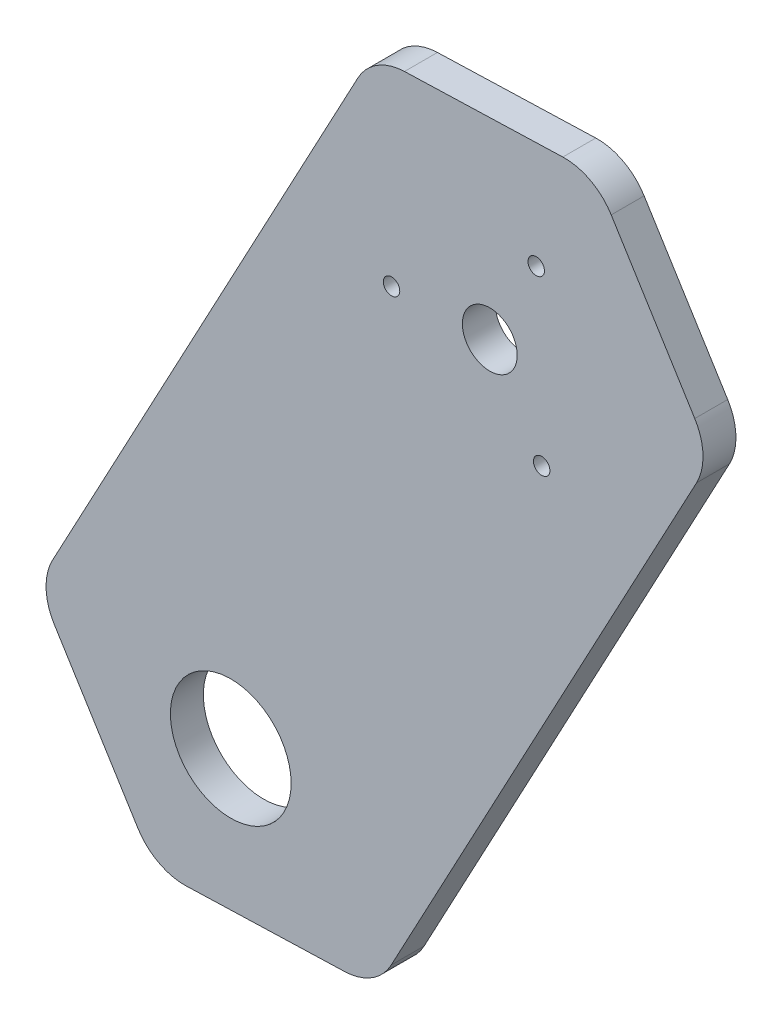
ISO-10303-21;
HEADER;
FILE_DESCRIPTION(('STEP AP214'),'2;1');
FILE_NAME('part.step','',(''),(''),'','','');
FILE_SCHEMA(('AUTOMOTIVE_DESIGN { 1 0 10303 214 1 1 1 1 }'));
ENDSEC;
DATA;
#1=APPLICATION_CONTEXT('core data for automotive mechanical design processes');
#2=APPLICATION_PROTOCOL_DEFINITION('international standard','automotive_design',2000,#1);
#3=PRODUCT_CONTEXT('',#1,'mechanical');
#4=PRODUCT('Part','Part','',(#3));
#5=PRODUCT_RELATED_PRODUCT_CATEGORY('part','',(#4));
#6=PRODUCT_DEFINITION_FORMATION('','',#4);
#7=PRODUCT_DEFINITION_CONTEXT('part definition',#1,'design');
#8=PRODUCT_DEFINITION('design','',#6,#7);
#9=PRODUCT_DEFINITION_SHAPE('','',#8);
#10=(LENGTH_UNIT() NAMED_UNIT(*) SI_UNIT(.MILLI.,.METRE.));
#11=(NAMED_UNIT(*) PLANE_ANGLE_UNIT() SI_UNIT($,.RADIAN.));
#12=(NAMED_UNIT(*) SI_UNIT($,.STERADIAN.) SOLID_ANGLE_UNIT());
#13=UNCERTAINTY_MEASURE_WITH_UNIT(LENGTH_MEASURE(1.E-05),#10,'distance_accuracy_value','');
#14=(GEOMETRIC_REPRESENTATION_CONTEXT(3) GLOBAL_UNCERTAINTY_ASSIGNED_CONTEXT((#13)) GLOBAL_UNIT_ASSIGNED_CONTEXT((#10,
#11,#12)) REPRESENTATION_CONTEXT('',''));
#15=CARTESIAN_POINT('',(0.,0.,0.));
#16=DIRECTION('',(0.,0.,1.));
#17=DIRECTION('',(1.,0.,0.));
#18=AXIS2_PLACEMENT_3D('',#15,#16,#17);
#19=CARTESIAN_POINT('',(33.0816922006675,382.696308573384,6.));
#20=DIRECTION('',(0.,0.,1.));
#21=DIRECTION('',(1.,0.,0.));
#22=AXIS2_PLACEMENT_3D('',#19,#20,#21);
#23=PLANE('',#22);
#24=CARTESIAN_POINT('',(30.4001110546229,357.59764771991,6.));
#25=DIRECTION('',(0.,0.,1.));
#26=DIRECTION('',(1.,0.,0.));
#27=AXIS2_PLACEMENT_3D('',#24,#25,#26);
#28=CIRCLE('',#27,1.50000000000101);
#29=CARTESIAN_POINT('',(31.9001110546239,357.59764771991,6.));
#30=VERTEX_POINT('',#29);
#31=EDGE_CURVE('E302',#30,#30,#28,.T.);
#32=ORIENTED_EDGE('',*,*,#31,.F.);
#33=EDGE_LOOP('',(#32));
#34=FACE_BOUND('',#33,.T.);
#35=CARTESIAN_POINT('',(57.7585097588959,342.948926532445,6.));
#36=DIRECTION('',(0.,0.,1.));
#37=DIRECTION('',(1.,0.,0.));
#38=AXIS2_PLACEMENT_3D('',#35,#36,#37);
#39=CIRCLE('',#38,1.50000000000001);
#40=CARTESIAN_POINT('',(59.2585097588959,342.948926532445,6.));
#41=VERTEX_POINT('',#40);
#42=EDGE_CURVE('E314',#41,#41,#39,.T.);
#43=ORIENTED_EDGE('',*,*,#42,.F.);
#44=EDGE_LOOP('',(#43));
#45=FACE_BOUND('',#44,.T.);
#46=CARTESIAN_POINT('',(33.0816922006675,382.696308573384,6.));
#47=DIRECTION('',(0.,0.,1.));
#48=DIRECTION('',(1.,0.,0.));
#49=AXIS2_PLACEMENT_3D('',#46,#47,#48);
#50=CIRCLE('',#49,10.0000000000104);
#51=CARTESIAN_POINT('',(32.7617023836289,392.691187588019,6.));
#52=VERTEX_POINT('',#51);
#53=CARTESIAN_POINT('',(24.2658781577215,387.416628770193,6.));
#54=VERTEX_POINT('',#53);
#55=EDGE_CURVE('E184',#52,#54,#50,.T.);
#56=ORIENTED_EDGE('',*,*,#55,.T.);
#57=DIRECTION('',(-0.472032019680439,-0.881581404293674,0.));
#58=VECTOR('',#57,1.);
#59=CARTESIAN_POINT('',(-31.3713622752696,283.506820733978,6.));
#60=LINE('',#59,#58);
#61=CARTESIAN_POINT('',(-31.3713622752696,283.506820733978,6.));
#62=VERTEX_POINT('',#61);
#63=EDGE_CURVE('E112',#54,#62,#60,.T.);
#64=ORIENTED_EDGE('',*,*,#63,.T.);
#65=CARTESIAN_POINT('',(-22.5555482323431,278.786500537179,6.));
#66=DIRECTION('',(0.,0.,1.));
#67=DIRECTION('',(1.,0.,0.));
#68=AXIS2_PLACEMENT_3D('',#65,#66,#67);
#69=CIRCLE('',#68,9.99999999998837);
#70=CARTESIAN_POINT('',(-31.0513724582303,273.511941719364,6.));
#71=VERTEX_POINT('',#70);
#72=EDGE_CURVE('E211',#62,#71,#69,.T.);
#73=ORIENTED_EDGE('',*,*,#72,.T.);
#74=DIRECTION('',(0.527455881781989,-0.849582422589818,0.));
#75=VECTOR('',#74,1.);
#76=CARTESIAN_POINT('',(-15.8250326916056,248.986609700313,6.));
#77=LINE('',#76,#75);
#78=CARTESIAN_POINT('',(-15.8250326916056,248.986609700313,6.));
#79=VERTEX_POINT('',#78);
#80=EDGE_CURVE('E230',#71,#79,#77,.T.);
#81=ORIENTED_EDGE('',*,*,#80,.T.);
#82=CARTESIAN_POINT('',(-7.32920846570756,254.261168518133,6.));
#83=DIRECTION('',(0.,0.,1.));
#84=DIRECTION('',(1.,0.,0.));
#85=AXIS2_PLACEMENT_3D('',#82,#83,#84);
#86=CIRCLE('',#85,9.99999999999989);
#87=CARTESIAN_POINT('',(-7.00921864866926,244.266289503508,6.));
#88=VERTEX_POINT('',#87);
#89=EDGE_CURVE('E227',#79,#88,#86,.T.);
#90=ORIENTED_EDGE('',*,*,#89,.T.);
#91=DIRECTION('',(0.999487901462503,0.0319989817038313,0.));
#92=VECTOR('',#91,1.);
#93=CARTESIAN_POINT('',(21.8435117993893,245.190020538533,6.));
#94=LINE('',#93,#92);
#95=CARTESIAN_POINT('',(21.8435117993893,245.190020538533,6.));
#96=VERTEX_POINT('',#95);
#97=EDGE_CURVE('E229',#88,#96,#94,.T.);
#98=ORIENTED_EDGE('',*,*,#97,.T.);
#99=CARTESIAN_POINT('',(21.5235219823509,255.184899553158,6.));
#100=DIRECTION('',(0.,0.,1.));
#101=DIRECTION('',(1.,0.,0.));
#102=AXIS2_PLACEMENT_3D('',#99,#100,#101);
#103=CIRCLE('',#102,9.99999999999985);
#104=CARTESIAN_POINT('',(30.3393360252871,250.464579356352,6.));
#105=VERTEX_POINT('',#104);
#106=EDGE_CURVE('E232',#96,#105,#103,.T.);
#107=ORIENTED_EDGE('',*,*,#106,.T.);
#108=DIRECTION('',(0.472032019680519,0.881581404293631,0.));
#109=VECTOR('',#108,1.);
#110=CARTESIAN_POINT('',(85.9765764582877,354.374387392562,6.));
#111=LINE('',#110,#109);
#112=CARTESIAN_POINT('',(85.9765764582877,354.374387392562,6.));
#113=VERTEX_POINT('',#112);
#114=EDGE_CURVE('E238',#105,#113,#111,.T.);
#115=ORIENTED_EDGE('',*,*,#114,.T.);
#116=CARTESIAN_POINT('',(77.1607624153515,359.094707589367,6.));
#117=DIRECTION('',(0.,0.,1.));
#118=DIRECTION('',(1.,0.,0.));
#119=AXIS2_PLACEMENT_3D('',#116,#117,#118);
#120=CIRCLE('',#119,9.99999999999986);
#121=CARTESIAN_POINT('',(85.6565866412496,364.369266407187,6.));
#122=VERTEX_POINT('',#121);
#123=EDGE_CURVE('E143',#113,#122,#120,.T.);
#124=ORIENTED_EDGE('',*,*,#123,.T.);
#125=DIRECTION('',(-0.527455881781988,0.849582422589819,0.));
#126=VECTOR('',#125,1.);
#127=CARTESIAN_POINT('',(70.4302468746245,388.894598426239,6.));
#128=LINE('',#127,#126);
#129=CARTESIAN_POINT('',(70.4302468746245,388.894598426239,6.));
#130=VERTEX_POINT('',#129);
#131=EDGE_CURVE('E137',#122,#130,#128,.T.);
#132=ORIENTED_EDGE('',*,*,#131,.T.);
#133=CARTESIAN_POINT('',(61.9344226487265,383.620039608419,6.));
#134=DIRECTION('',(0.,0.,1.));
#135=DIRECTION('',(1.,0.,0.));
#136=AXIS2_PLACEMENT_3D('',#133,#134,#135);
#137=CIRCLE('',#136,9.99999999999985);
#138=CARTESIAN_POINT('',(61.6144328316882,393.614918623044,6.));
#139=VERTEX_POINT('',#138);
#140=EDGE_CURVE('E141',#130,#139,#137,.T.);
#141=ORIENTED_EDGE('',*,*,#140,.T.);
#142=DIRECTION('',(-0.999487901462503,-0.0319989817038246,0.));
#143=VECTOR('',#142,1.);
#144=CARTESIAN_POINT('',(32.7617023836289,392.691187588019,6.));
#145=LINE('',#144,#143);
#146=EDGE_CURVE('E57',#139,#52,#145,.T.);
#147=ORIENTED_EDGE('',*,*,#146,.T.);
#148=EDGE_LOOP('',(#56,#64,#73,#81,#90,#98,#107,#115,#124,#132,#141,#147));
#149=FACE_BOUND('',#148,.T.);
#150=CARTESIAN_POINT('',(1.10482999928468,270.012836124959,6.));
#151=DIRECTION('',(0.,0.,1.));
#152=DIRECTION('',(1.,0.,0.));
#153=AXIS2_PLACEMENT_3D('',#150,#151,#152);
#154=CIRCLE('',#153,10.9999999999999);
#155=CARTESIAN_POINT('',(12.1048299992846,270.012836124959,6.));
#156=VERTEX_POINT('',#155);
#157=EDGE_CURVE('E165',#156,#156,#154,.T.);
#158=ORIENTED_EDGE('',*,*,#157,.F.);
#159=EDGE_LOOP('',(#158));
#160=FACE_BOUND('',#159,.T.);
#161=CARTESIAN_POINT('',(56.7654750880588,373.966355410941,6.));
#162=DIRECTION('',(0.,0.,1.));
#163=DIRECTION('',(1.,0.,0.));
#164=AXIS2_PLACEMENT_3D('',#161,#162,#163);
#165=CIRCLE('',#164,1.5);
#166=CARTESIAN_POINT('',(58.2654750880588,373.966355410941,6.));
#167=VERTEX_POINT('',#166);
#168=EDGE_CURVE('E308',#167,#167,#165,.T.);
#169=ORIENTED_EDGE('',*,*,#168,.F.);
#170=EDGE_LOOP('',(#169));
#171=FACE_BOUND('',#170,.T.);
#172=CARTESIAN_POINT('',(48.3080319671885,358.170976554401,6.));
#173=DIRECTION('',(0.,0.,1.));
#174=DIRECTION('',(1.,0.,0.));
#175=AXIS2_PLACEMENT_3D('',#172,#173,#174);
#176=CIRCLE('',#175,4.99999999999982);
#177=CARTESIAN_POINT('',(53.3080319671883,358.170976554401,6.));
#178=VERTEX_POINT('',#177);
#179=EDGE_CURVE('E293',#178,#178,#176,.T.);
#180=ORIENTED_EDGE('',*,*,#179,.F.);
#181=EDGE_LOOP('',(#180));
#182=FACE_BOUND('',#181,.T.);
#183=ADVANCED_FACE('F40',(#34,#45,#149,#160,#171,#182),#23,.T.);
#184=CARTESIAN_POINT('',(33.0816922006675,382.696308573384,0.));
#185=DIRECTION('',(0.,0.,1.));
#186=DIRECTION('',(1.,0.,0.));
#187=AXIS2_PLACEMENT_3D('',#184,#185,#186);
#188=PLANE('',#187);
#189=CARTESIAN_POINT('',(33.0816922006675,382.696308573384,0.));
#190=DIRECTION('',(0.,0.,1.));
#191=DIRECTION('',(1.,0.,0.));
#192=AXIS2_PLACEMENT_3D('',#189,#190,#191);
#193=CIRCLE('',#192,10.0000000000104);
#194=CARTESIAN_POINT('',(32.7617023836289,392.691187588019,0.));
#195=VERTEX_POINT('',#194);
#196=CARTESIAN_POINT('',(24.2658781577215,387.416628770193,0.));
#197=VERTEX_POINT('',#196);
#198=EDGE_CURVE('E161',#195,#197,#193,.T.);
#199=ORIENTED_EDGE('',*,*,#198,.F.);
#200=DIRECTION('',(-0.999487901462503,-0.0319989817038246,0.));
#201=VECTOR('',#200,1.);
#202=CARTESIAN_POINT('',(32.7617023836289,392.691187588019,0.));
#203=LINE('',#202,#201);
#204=CARTESIAN_POINT('',(61.6144328316882,393.614918623044,0.));
#205=VERTEX_POINT('',#204);
#206=EDGE_CURVE('E104',#205,#195,#203,.T.);
#207=ORIENTED_EDGE('',*,*,#206,.F.);
#208=CARTESIAN_POINT('',(61.9344226487265,383.620039608419,0.));
#209=DIRECTION('',(0.,0.,1.));
#210=DIRECTION('',(1.,0.,0.));
#211=AXIS2_PLACEMENT_3D('',#208,#209,#210);
#212=CIRCLE('',#211,9.99999999999985);
#213=CARTESIAN_POINT('',(70.4302468746245,388.894598426239,0.));
#214=VERTEX_POINT('',#213);
#215=EDGE_CURVE('E98',#214,#205,#212,.T.);
#216=ORIENTED_EDGE('',*,*,#215,.F.);
#217=DIRECTION('',(-0.527455881781988,0.849582422589819,0.));
#218=VECTOR('',#217,1.);
#219=CARTESIAN_POINT('',(70.4302468746245,388.894598426239,0.));
#220=LINE('',#219,#218);
#221=CARTESIAN_POINT('',(85.6565866412496,364.369266407187,0.));
#222=VERTEX_POINT('',#221);
#223=EDGE_CURVE('E151',#222,#214,#220,.T.);
#224=ORIENTED_EDGE('',*,*,#223,.F.);
#225=CARTESIAN_POINT('',(77.1607624153515,359.094707589367,0.));
#226=DIRECTION('',(0.,0.,1.));
#227=DIRECTION('',(1.,0.,0.));
#228=AXIS2_PLACEMENT_3D('',#225,#226,#227);
#229=CIRCLE('',#228,9.99999999999986);
#230=CARTESIAN_POINT('',(85.9765764582877,354.374387392562,0.));
#231=VERTEX_POINT('',#230);
#232=EDGE_CURVE('E179',#231,#222,#229,.T.);
#233=ORIENTED_EDGE('',*,*,#232,.F.);
#234=DIRECTION('',(0.472032019680519,0.881581404293631,0.));
#235=VECTOR('',#234,1.);
#236=CARTESIAN_POINT('',(85.9765764582877,354.374387392562,0.));
#237=LINE('',#236,#235);
#238=CARTESIAN_POINT('',(30.3393360252871,250.464579356352,0.));
#239=VERTEX_POINT('',#238);
#240=EDGE_CURVE('E177',#239,#231,#237,.T.);
#241=ORIENTED_EDGE('',*,*,#240,.F.);
#242=CARTESIAN_POINT('',(21.5235219823509,255.184899553158,0.));
#243=DIRECTION('',(0.,0.,1.));
#244=DIRECTION('',(1.,0.,0.));
#245=AXIS2_PLACEMENT_3D('',#242,#243,#244);
#246=CIRCLE('',#245,9.99999999999985);
#247=CARTESIAN_POINT('',(21.8435117993893,245.190020538533,0.));
#248=VERTEX_POINT('',#247);
#249=EDGE_CURVE('E175',#248,#239,#246,.T.);
#250=ORIENTED_EDGE('',*,*,#249,.F.);
#251=DIRECTION('',(0.999487901462503,0.0319989817038313,0.));
#252=VECTOR('',#251,1.);
#253=CARTESIAN_POINT('',(21.8435117993893,245.190020538533,0.));
#254=LINE('',#253,#252);
#255=CARTESIAN_POINT('',(-7.00921864866926,244.266289503508,0.));
#256=VERTEX_POINT('',#255);
#257=EDGE_CURVE('E173',#256,#248,#254,.T.);
#258=ORIENTED_EDGE('',*,*,#257,.F.);
#259=CARTESIAN_POINT('',(-7.32920846570756,254.261168518133,0.));
#260=DIRECTION('',(0.,0.,1.));
#261=DIRECTION('',(1.,0.,0.));
#262=AXIS2_PLACEMENT_3D('',#259,#260,#261);
#263=CIRCLE('',#262,9.99999999999989);
#264=CARTESIAN_POINT('',(-15.8250326916056,248.986609700313,0.));
#265=VERTEX_POINT('',#264);
#266=EDGE_CURVE('E171',#265,#256,#263,.T.);
#267=ORIENTED_EDGE('',*,*,#266,.F.);
#268=DIRECTION('',(0.527455881781989,-0.849582422589818,0.));
#269=VECTOR('',#268,1.);
#270=CARTESIAN_POINT('',(-15.8250326916056,248.986609700313,0.));
#271=LINE('',#270,#269);
#272=CARTESIAN_POINT('',(-31.0513724582303,273.511941719364,0.));
#273=VERTEX_POINT('',#272);
#274=EDGE_CURVE('E169',#273,#265,#271,.T.);
#275=ORIENTED_EDGE('',*,*,#274,.F.);
#276=CARTESIAN_POINT('',(-22.5555482323431,278.786500537179,0.));
#277=DIRECTION('',(0.,0.,1.));
#278=DIRECTION('',(1.,0.,0.));
#279=AXIS2_PLACEMENT_3D('',#276,#277,#278);
#280=CIRCLE('',#279,9.99999999998837);
#281=CARTESIAN_POINT('',(-31.3713622752696,283.506820733978,0.));
#282=VERTEX_POINT('',#281);
#283=EDGE_CURVE('E167',#282,#273,#280,.T.);
#284=ORIENTED_EDGE('',*,*,#283,.F.);
#285=DIRECTION('',(-0.472032019680439,-0.881581404293674,0.));
#286=VECTOR('',#285,1.);
#287=CARTESIAN_POINT('',(-31.3713622752696,283.506820733978,0.));
#288=LINE('',#287,#286);
#289=EDGE_CURVE('E164',#197,#282,#288,.T.);
#290=ORIENTED_EDGE('',*,*,#289,.F.);
#291=EDGE_LOOP('',(#199,#207,#216,#224,#233,#241,#250,#258,#267,#275,#284,#290));
#292=FACE_BOUND('',#291,.T.);
#293=CARTESIAN_POINT('',(1.10482999928468,270.012836124959,0.));
#294=DIRECTION('',(0.,0.,1.));
#295=DIRECTION('',(1.,0.,0.));
#296=AXIS2_PLACEMENT_3D('',#293,#294,#295);
#297=CIRCLE('',#296,10.9999999999999);
#298=CARTESIAN_POINT('',(12.1048299992846,270.012836124959,0.));
#299=VERTEX_POINT('',#298);
#300=EDGE_CURVE('E317',#299,#299,#297,.T.);
#301=ORIENTED_EDGE('',*,*,#300,.T.);
#302=EDGE_LOOP('',(#301));
#303=FACE_BOUND('',#302,.T.);
#304=CARTESIAN_POINT('',(57.7585097588959,342.948926532445,0.));
#305=DIRECTION('',(0.,0.,1.));
#306=DIRECTION('',(1.,0.,0.));
#307=AXIS2_PLACEMENT_3D('',#304,#305,#306);
#308=CIRCLE('',#307,1.50000000000001);
#309=CARTESIAN_POINT('',(59.2585097588959,342.948926532445,0.));
#310=VERTEX_POINT('',#309);
#311=EDGE_CURVE('E311',#310,#310,#308,.T.);
#312=ORIENTED_EDGE('',*,*,#311,.T.);
#313=EDGE_LOOP('',(#312));
#314=FACE_BOUND('',#313,.T.);
#315=CARTESIAN_POINT('',(56.7654750880588,373.966355410941,0.));
#316=DIRECTION('',(0.,0.,1.));
#317=DIRECTION('',(1.,0.,0.));
#318=AXIS2_PLACEMENT_3D('',#315,#316,#317);
#319=CIRCLE('',#318,1.5);
#320=CARTESIAN_POINT('',(58.2654750880588,373.966355410941,0.));
#321=VERTEX_POINT('',#320);
#322=EDGE_CURVE('E305',#321,#321,#319,.T.);
#323=ORIENTED_EDGE('',*,*,#322,.T.);
#324=EDGE_LOOP('',(#323));
#325=FACE_BOUND('',#324,.T.);
#326=CARTESIAN_POINT('',(30.4001110546229,357.59764771991,0.));
#327=DIRECTION('',(0.,0.,1.));
#328=DIRECTION('',(1.,0.,0.));
#329=AXIS2_PLACEMENT_3D('',#326,#327,#328);
#330=CIRCLE('',#329,1.50000000000101);
#331=CARTESIAN_POINT('',(31.9001110546239,357.59764771991,0.));
#332=VERTEX_POINT('',#331);
#333=EDGE_CURVE('E299',#332,#332,#330,.T.);
#334=ORIENTED_EDGE('',*,*,#333,.T.);
#335=EDGE_LOOP('',(#334));
#336=FACE_BOUND('',#335,.T.);
#337=CARTESIAN_POINT('',(48.3080319671885,358.170976554401,0.));
#338=DIRECTION('',(0.,0.,1.));
#339=DIRECTION('',(1.,0.,0.));
#340=AXIS2_PLACEMENT_3D('',#337,#338,#339);
#341=CIRCLE('',#340,4.99999999999982);
#342=CARTESIAN_POINT('',(53.3080319671883,358.170976554401,0.));
#343=VERTEX_POINT('',#342);
#344=EDGE_CURVE('E296',#343,#343,#341,.T.);
#345=ORIENTED_EDGE('',*,*,#344,.T.);
#346=EDGE_LOOP('',(#345));
#347=FACE_BOUND('',#346,.T.);
#348=ADVANCED_FACE('F215',(#292,#303,#314,#325,#336,#347),#188,.F.);
#349=CARTESIAN_POINT('',(33.0816922006675,382.696308573384,6.));
#350=DIRECTION('',(0.,0.,-1.));
#351=DIRECTION('',(-1.,0.,0.));
#352=AXIS2_PLACEMENT_3D('',#349,#350,#351);
#353=CYLINDRICAL_SURFACE('',#352,10.0000000000104);
#354=ORIENTED_EDGE('',*,*,#198,.T.);
#355=DIRECTION('',(0.,0.,-1.));
#356=VECTOR('',#355,1.);
#357=CARTESIAN_POINT('',(24.2658781577215,387.416628770193,6.));
#358=LINE('',#357,#356);
#359=EDGE_CURVE('E11',#54,#197,#358,.T.);
#360=ORIENTED_EDGE('',*,*,#359,.F.);
#361=ORIENTED_EDGE('',*,*,#55,.F.);
#362=DIRECTION('',(0.,0.,-1.));
#363=VECTOR('',#362,1.);
#364=CARTESIAN_POINT('',(32.7617023836289,392.691187588019,6.));
#365=LINE('',#364,#363);
#366=EDGE_CURVE('E157',#52,#195,#365,.T.);
#367=ORIENTED_EDGE('',*,*,#366,.T.);
#368=EDGE_LOOP('',(#354,#360,#361,#367));
#369=FACE_BOUND('',#368,.T.);
#370=ADVANCED_FACE('F42',(#369),#353,.T.);
#371=CARTESIAN_POINT('',(-31.3713622752696,283.506820733978,6.));
#372=DIRECTION('',(0.881581404293674,-0.472032019680439,0.));
#373=DIRECTION('',(0.472032019680439,0.881581404293674,0.));
#374=AXIS2_PLACEMENT_3D('',#371,#372,#373);
#375=PLANE('',#374);
#376=ORIENTED_EDGE('',*,*,#289,.T.);
#377=DIRECTION('',(0.,0.,-1.));
#378=VECTOR('',#377,1.);
#379=CARTESIAN_POINT('',(-31.3713622752696,283.506820733978,6.));
#380=LINE('',#379,#378);
#381=EDGE_CURVE('E49',#62,#282,#380,.T.);
#382=ORIENTED_EDGE('',*,*,#381,.F.);
#383=ORIENTED_EDGE('',*,*,#63,.F.);
#384=ORIENTED_EDGE('',*,*,#359,.T.);
#385=EDGE_LOOP('',(#376,#382,#383,#384));
#386=FACE_BOUND('',#385,.T.);
#387=ADVANCED_FACE('F446',(#386),#375,.F.);
#388=CARTESIAN_POINT('',(-22.5555482323431,278.786500537179,6.));
#389=DIRECTION('',(0.,0.,-1.));
#390=DIRECTION('',(-1.,0.,0.));
#391=AXIS2_PLACEMENT_3D('',#388,#389,#390);
#392=CYLINDRICAL_SURFACE('',#391,9.99999999998837);
#393=ORIENTED_EDGE('',*,*,#283,.T.);
#394=DIRECTION('',(0.,0.,-1.));
#395=VECTOR('',#394,1.);
#396=CARTESIAN_POINT('',(-31.0513724582303,273.511941719364,6.));
#397=LINE('',#396,#395);
#398=EDGE_CURVE('E203',#71,#273,#397,.T.);
#399=ORIENTED_EDGE('',*,*,#398,.F.);
#400=ORIENTED_EDGE('',*,*,#72,.F.);
#401=ORIENTED_EDGE('',*,*,#381,.T.);
#402=EDGE_LOOP('',(#393,#399,#400,#401));
#403=FACE_BOUND('',#402,.T.);
#404=ADVANCED_FACE('F209',(#403),#392,.T.);
#405=CARTESIAN_POINT('',(-15.8250326916056,248.986609700313,6.));
#406=DIRECTION('',(0.849582422589818,0.527455881781989,0.));
#407=DIRECTION('',(-0.527455881781989,0.849582422589818,0.));
#408=AXIS2_PLACEMENT_3D('',#405,#406,#407);
#409=PLANE('',#408);
#410=ORIENTED_EDGE('',*,*,#274,.T.);
#411=DIRECTION('',(0.,0.,-1.));
#412=VECTOR('',#411,1.);
#413=CARTESIAN_POINT('',(-15.8250326916056,248.986609700313,6.));
#414=LINE('',#413,#412);
#415=EDGE_CURVE('E200',#79,#265,#414,.T.);
#416=ORIENTED_EDGE('',*,*,#415,.F.);
#417=ORIENTED_EDGE('',*,*,#80,.F.);
#418=ORIENTED_EDGE('',*,*,#398,.T.);
#419=EDGE_LOOP('',(#410,#416,#417,#418));
#420=FACE_BOUND('',#419,.T.);
#421=ADVANCED_FACE('F221',(#420),#409,.F.);
#422=CARTESIAN_POINT('',(-7.32920846570756,254.261168518133,6.));
#423=DIRECTION('',(0.,0.,-1.));
#424=DIRECTION('',(-1.,0.,0.));
#425=AXIS2_PLACEMENT_3D('',#422,#423,#424);
#426=CYLINDRICAL_SURFACE('',#425,9.99999999999989);
#427=ORIENTED_EDGE('',*,*,#266,.T.);
#428=DIRECTION('',(0.,0.,-1.));
#429=VECTOR('',#428,1.);
#430=CARTESIAN_POINT('',(-7.00921864866926,244.266289503508,6.));
#431=LINE('',#430,#429);
#432=EDGE_CURVE('E197',#88,#256,#431,.T.);
#433=ORIENTED_EDGE('',*,*,#432,.F.);
#434=ORIENTED_EDGE('',*,*,#89,.F.);
#435=ORIENTED_EDGE('',*,*,#415,.T.);
#436=EDGE_LOOP('',(#427,#433,#434,#435));
#437=FACE_BOUND('',#436,.T.);
#438=ADVANCED_FACE('F225',(#437),#426,.T.);
#439=CARTESIAN_POINT('',(21.8435117993893,245.190020538533,6.));
#440=DIRECTION('',(-0.0319989817038313,0.999487901462503,0.));
#441=DIRECTION('',(-0.999487901462503,-0.0319989817038313,0.));
#442=AXIS2_PLACEMENT_3D('',#439,#440,#441);
#443=PLANE('',#442);
#444=ORIENTED_EDGE('',*,*,#257,.T.);
#445=DIRECTION('',(0.,0.,-1.));
#446=VECTOR('',#445,1.);
#447=CARTESIAN_POINT('',(21.8435117993893,245.190020538533,6.));
#448=LINE('',#447,#446);
#449=EDGE_CURVE('E194',#96,#248,#448,.T.);
#450=ORIENTED_EDGE('',*,*,#449,.F.);
#451=ORIENTED_EDGE('',*,*,#97,.F.);
#452=ORIENTED_EDGE('',*,*,#432,.T.);
#453=EDGE_LOOP('',(#444,#450,#451,#452));
#454=FACE_BOUND('',#453,.T.);
#455=ADVANCED_FACE('F407',(#454),#443,.F.);
#456=CARTESIAN_POINT('',(21.5235219823509,255.184899553158,6.));
#457=DIRECTION('',(0.,0.,-1.));
#458=DIRECTION('',(-1.,0.,0.));
#459=AXIS2_PLACEMENT_3D('',#456,#457,#458);
#460=CYLINDRICAL_SURFACE('',#459,9.99999999999985);
#461=ORIENTED_EDGE('',*,*,#249,.T.);
#462=DIRECTION('',(0.,0.,-1.));
#463=VECTOR('',#462,1.);
#464=CARTESIAN_POINT('',(30.3393360252871,250.464579356352,6.));
#465=LINE('',#464,#463);
#466=EDGE_CURVE('E191',#105,#239,#465,.T.);
#467=ORIENTED_EDGE('',*,*,#466,.F.);
#468=ORIENTED_EDGE('',*,*,#106,.F.);
#469=ORIENTED_EDGE('',*,*,#449,.T.);
#470=EDGE_LOOP('',(#461,#467,#468,#469));
#471=FACE_BOUND('',#470,.T.);
#472=ADVANCED_FACE('F397',(#471),#460,.T.);
#473=CARTESIAN_POINT('',(85.9765764582877,354.374387392562,6.));
#474=DIRECTION('',(-0.881581404293631,0.472032019680519,0.));
#475=DIRECTION('',(-0.472032019680519,-0.881581404293631,0.));
#476=AXIS2_PLACEMENT_3D('',#473,#474,#475);
#477=PLANE('',#476);
#478=ORIENTED_EDGE('',*,*,#240,.T.);
#479=DIRECTION('',(0.,0.,-1.));
#480=VECTOR('',#479,1.);
#481=CARTESIAN_POINT('',(85.9765764582877,354.374387392562,6.));
#482=LINE('',#481,#480);
#483=EDGE_CURVE('E188',#113,#231,#482,.T.);
#484=ORIENTED_EDGE('',*,*,#483,.F.);
#485=ORIENTED_EDGE('',*,*,#114,.F.);
#486=ORIENTED_EDGE('',*,*,#466,.T.);
#487=EDGE_LOOP('',(#478,#484,#485,#486));
#488=FACE_BOUND('',#487,.T.);
#489=ADVANCED_FACE('F244',(#488),#477,.F.);
#490=CARTESIAN_POINT('',(77.1607624153515,359.094707589367,6.));
#491=DIRECTION('',(0.,0.,-1.));
#492=DIRECTION('',(-1.,0.,0.));
#493=AXIS2_PLACEMENT_3D('',#490,#491,#492);
#494=CYLINDRICAL_SURFACE('',#493,9.99999999999986);
#495=ORIENTED_EDGE('',*,*,#232,.T.);
#496=DIRECTION('',(0.,0.,-1.));
#497=VECTOR('',#496,1.);
#498=CARTESIAN_POINT('',(85.6565866412496,364.369266407187,6.));
#499=LINE('',#498,#497);
#500=EDGE_CURVE('E152',#122,#222,#499,.T.);
#501=ORIENTED_EDGE('',*,*,#500,.F.);
#502=ORIENTED_EDGE('',*,*,#123,.F.);
#503=ORIENTED_EDGE('',*,*,#483,.T.);
#504=EDGE_LOOP('',(#495,#501,#502,#503));
#505=FACE_BOUND('',#504,.T.);
#506=ADVANCED_FACE('F248',(#505),#494,.T.);
#507=CARTESIAN_POINT('',(70.4302468746245,388.894598426239,6.));
#508=DIRECTION('',(-0.849582422589819,-0.527455881781988,0.));
#509=DIRECTION('',(0.527455881781988,-0.849582422589819,0.));
#510=AXIS2_PLACEMENT_3D('',#507,#508,#509);
#511=PLANE('',#510);
#512=ORIENTED_EDGE('',*,*,#223,.T.);
#513=DIRECTION('',(0.,0.,-1.));
#514=VECTOR('',#513,1.);
#515=CARTESIAN_POINT('',(70.4302468746245,388.894598426239,6.));
#516=LINE('',#515,#514);
#517=EDGE_CURVE('E148',#130,#214,#516,.T.);
#518=ORIENTED_EDGE('',*,*,#517,.F.);
#519=ORIENTED_EDGE('',*,*,#131,.F.);
#520=ORIENTED_EDGE('',*,*,#500,.T.);
#521=EDGE_LOOP('',(#512,#518,#519,#520));
#522=FACE_BOUND('',#521,.T.);
#523=ADVANCED_FACE('F149',(#522),#511,.F.);
#524=CARTESIAN_POINT('',(61.9344226487265,383.620039608419,6.));
#525=DIRECTION('',(0.,0.,-1.));
#526=DIRECTION('',(-1.,0.,0.));
#527=AXIS2_PLACEMENT_3D('',#524,#525,#526);
#528=CYLINDRICAL_SURFACE('',#527,9.99999999999985);
#529=ORIENTED_EDGE('',*,*,#215,.T.);
#530=DIRECTION('',(0.,0.,-1.));
#531=VECTOR('',#530,1.);
#532=CARTESIAN_POINT('',(61.6144328316882,393.614918623044,6.));
#533=LINE('',#532,#531);
#534=EDGE_CURVE('E153',#139,#205,#533,.T.);
#535=ORIENTED_EDGE('',*,*,#534,.F.);
#536=ORIENTED_EDGE('',*,*,#140,.F.);
#537=ORIENTED_EDGE('',*,*,#517,.T.);
#538=EDGE_LOOP('',(#529,#535,#536,#537));
#539=FACE_BOUND('',#538,.T.);
#540=ADVANCED_FACE('F155',(#539),#528,.T.);
#541=CARTESIAN_POINT('',(32.7617023836289,392.691187588019,6.));
#542=DIRECTION('',(0.0319989817038246,-0.999487901462503,0.));
#543=DIRECTION('',(0.999487901462503,0.0319989817038246,0.));
#544=AXIS2_PLACEMENT_3D('',#541,#542,#543);
#545=PLANE('',#544);
#546=ORIENTED_EDGE('',*,*,#206,.T.);
#547=ORIENTED_EDGE('',*,*,#366,.F.);
#548=ORIENTED_EDGE('',*,*,#146,.F.);
#549=ORIENTED_EDGE('',*,*,#534,.T.);
#550=EDGE_LOOP('',(#546,#547,#548,#549));
#551=FACE_BOUND('',#550,.T.);
#552=ADVANCED_FACE('F252',(#551),#545,.F.);
#553=CARTESIAN_POINT('',(1.10482999928468,270.012836124959,6.));
#554=DIRECTION('',(0.,0.,-1.));
#555=DIRECTION('',(-1.,0.,0.));
#556=AXIS2_PLACEMENT_3D('',#553,#554,#555);
#557=CYLINDRICAL_SURFACE('',#556,10.9999999999999);
#558=ORIENTED_EDGE('',*,*,#157,.T.);
#559=EDGE_LOOP('',(#558));
#560=FACE_BOUND('',#559,.T.);
#561=ORIENTED_EDGE('',*,*,#300,.F.);
#562=EDGE_LOOP('',(#561));
#563=FACE_BOUND('',#562,.T.);
#564=ADVANCED_FACE('F254',(#560,#563),#557,.F.);
#565=CARTESIAN_POINT('',(57.7585097588959,342.948926532445,6.));
#566=DIRECTION('',(0.,0.,-1.));
#567=DIRECTION('',(-1.,0.,0.));
#568=AXIS2_PLACEMENT_3D('',#565,#566,#567);
#569=CYLINDRICAL_SURFACE('',#568,1.50000000000001);
#570=ORIENTED_EDGE('',*,*,#42,.T.);
#571=EDGE_LOOP('',(#570));
#572=FACE_BOUND('',#571,.T.);
#573=ORIENTED_EDGE('',*,*,#311,.F.);
#574=EDGE_LOOP('',(#573));
#575=FACE_BOUND('',#574,.T.);
#576=ADVANCED_FACE('F260',(#572,#575),#569,.F.);
#577=CARTESIAN_POINT('',(56.7654750880588,373.966355410941,6.));
#578=DIRECTION('',(0.,0.,-1.));
#579=DIRECTION('',(-1.,0.,0.));
#580=AXIS2_PLACEMENT_3D('',#577,#578,#579);
#581=CYLINDRICAL_SURFACE('',#580,1.5);
#582=ORIENTED_EDGE('',*,*,#168,.T.);
#583=EDGE_LOOP('',(#582));
#584=FACE_BOUND('',#583,.T.);
#585=ORIENTED_EDGE('',*,*,#322,.F.);
#586=EDGE_LOOP('',(#585));
#587=FACE_BOUND('',#586,.T.);
#588=ADVANCED_FACE('F276',(#584,#587),#581,.F.);
#589=CARTESIAN_POINT('',(30.4001110546229,357.59764771991,6.));
#590=DIRECTION('',(0.,0.,-1.));
#591=DIRECTION('',(-1.,0.,0.));
#592=AXIS2_PLACEMENT_3D('',#589,#590,#591);
#593=CYLINDRICAL_SURFACE('',#592,1.50000000000101);
#594=ORIENTED_EDGE('',*,*,#31,.T.);
#595=EDGE_LOOP('',(#594));
#596=FACE_BOUND('',#595,.T.);
#597=ORIENTED_EDGE('',*,*,#333,.F.);
#598=EDGE_LOOP('',(#597));
#599=FACE_BOUND('',#598,.T.);
#600=ADVANCED_FACE('F280',(#596,#599),#593,.F.);
#601=CARTESIAN_POINT('',(48.3080319671885,358.170976554401,6.));
#602=DIRECTION('',(0.,0.,-1.));
#603=DIRECTION('',(-1.,0.,0.));
#604=AXIS2_PLACEMENT_3D('',#601,#602,#603);
#605=CYLINDRICAL_SURFACE('',#604,4.99999999999982);
#606=ORIENTED_EDGE('',*,*,#179,.T.);
#607=EDGE_LOOP('',(#606));
#608=FACE_BOUND('',#607,.T.);
#609=ORIENTED_EDGE('',*,*,#344,.F.);
#610=EDGE_LOOP('',(#609));
#611=FACE_BOUND('',#610,.T.);
#612=ADVANCED_FACE('F284',(#608,#611),#605,.F.);
#613=CLOSED_SHELL('',(#183,#348,#370,#387,#404,#421,#438,#455,#472,#489,#506,#523,#540,#552,
#564,#576,#588,#600,#612));
#614=MANIFOLD_SOLID_BREP('B2',#613);
#615=ADVANCED_BREP_SHAPE_REPRESENTATION('',(#18,#614),#14);
#616=SHAPE_DEFINITION_REPRESENTATION(#9,#615);
ENDSEC;
END-ISO-10303-21;
